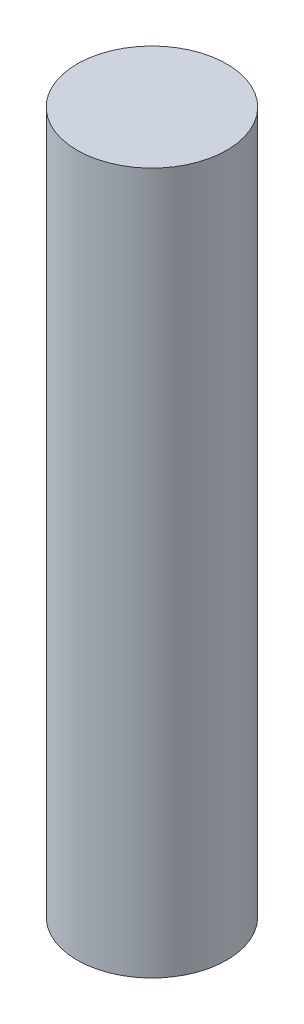
ISO-10303-21;
HEADER;
FILE_DESCRIPTION(('STEP AP214'),'2;1');
FILE_NAME('part.step','',(''),(''),'','','');
FILE_SCHEMA(('AUTOMOTIVE_DESIGN { 1 0 10303 214 1 1 1 1 }'));
ENDSEC;
DATA;
#1=APPLICATION_CONTEXT('core data for automotive mechanical design processes');
#2=APPLICATION_PROTOCOL_DEFINITION('international standard','automotive_design',2000,#1);
#3=PRODUCT_CONTEXT('',#1,'mechanical');
#4=PRODUCT('Part','Part','',(#3));
#5=PRODUCT_RELATED_PRODUCT_CATEGORY('part','',(#4));
#6=PRODUCT_DEFINITION_FORMATION('','',#4);
#7=PRODUCT_DEFINITION_CONTEXT('part definition',#1,'design');
#8=PRODUCT_DEFINITION('design','',#6,#7);
#9=PRODUCT_DEFINITION_SHAPE('','',#8);
#10=(LENGTH_UNIT() NAMED_UNIT(*) SI_UNIT(.MILLI.,.METRE.));
#11=(NAMED_UNIT(*) PLANE_ANGLE_UNIT() SI_UNIT($,.RADIAN.));
#12=(NAMED_UNIT(*) SI_UNIT($,.STERADIAN.) SOLID_ANGLE_UNIT());
#13=UNCERTAINTY_MEASURE_WITH_UNIT(LENGTH_MEASURE(1.E-05),#10,'distance_accuracy_value','');
#14=(GEOMETRIC_REPRESENTATION_CONTEXT(3) GLOBAL_UNCERTAINTY_ASSIGNED_CONTEXT((#13)) GLOBAL_UNIT_ASSIGNED_CONTEXT((#10,
#11,#12)) REPRESENTATION_CONTEXT('',''));
#15=CARTESIAN_POINT('',(0.,0.,0.));
#16=DIRECTION('',(0.,0.,1.));
#17=DIRECTION('',(1.,0.,0.));
#18=AXIS2_PLACEMENT_3D('',#15,#16,#17);
#19=CARTESIAN_POINT('',(0.,15.,0.));
#20=DIRECTION('',(0.,-1.,0.));
#21=DIRECTION('',(0.,0.,-1.));
#22=AXIS2_PLACEMENT_3D('',#19,#20,#21);
#23=CYLINDRICAL_SURFACE('',#22,1.6);
#24=CARTESIAN_POINT('',(0.,15.,0.));
#25=DIRECTION('',(0.,1.,0.));
#26=DIRECTION('',(0.,0.,1.));
#27=AXIS2_PLACEMENT_3D('',#24,#25,#26);
#28=CIRCLE('',#27,1.6);
#29=CARTESIAN_POINT('',(0.,15.,1.6));
#30=VERTEX_POINT('',#29);
#31=EDGE_CURVE('E10',#30,#30,#28,.T.);
#32=ORIENTED_EDGE('',*,*,#31,.F.);
#33=EDGE_LOOP('',(#32));
#34=FACE_BOUND('',#33,.T.);
#35=CARTESIAN_POINT('',(0.,0.,0.));
#36=DIRECTION('',(0.,1.,0.));
#37=DIRECTION('',(0.,0.,1.));
#38=AXIS2_PLACEMENT_3D('',#35,#36,#37);
#39=CIRCLE('',#38,1.6);
#40=CARTESIAN_POINT('',(0.,0.,1.6));
#41=VERTEX_POINT('',#40);
#42=EDGE_CURVE('E40',#41,#41,#39,.T.);
#43=ORIENTED_EDGE('',*,*,#42,.T.);
#44=EDGE_LOOP('',(#43));
#45=FACE_BOUND('',#44,.T.);
#46=ADVANCED_FACE('F37',(#34,#45),#23,.T.);
#47=CARTESIAN_POINT('',(0.,15.,0.));
#48=DIRECTION('',(0.,1.,0.));
#49=DIRECTION('',(0.,0.,1.));
#50=AXIS2_PLACEMENT_3D('',#47,#48,#49);
#51=PLANE('',#50);
#52=ORIENTED_EDGE('',*,*,#31,.T.);
#53=EDGE_LOOP('',(#52));
#54=FACE_BOUND('',#53,.T.);
#55=ADVANCED_FACE('F52',(#54),#51,.T.);
#56=CARTESIAN_POINT('',(0.,0.,0.));
#57=DIRECTION('',(0.,1.,0.));
#58=DIRECTION('',(0.,0.,1.));
#59=AXIS2_PLACEMENT_3D('',#56,#57,#58);
#60=PLANE('',#59);
#61=ORIENTED_EDGE('',*,*,#42,.F.);
#62=EDGE_LOOP('',(#61));
#63=FACE_BOUND('',#62,.T.);
#64=ADVANCED_FACE('F50',(#63),#60,.F.);
#65=CLOSED_SHELL('',(#46,#55,#64));
#66=MANIFOLD_SOLID_BREP('B2',#65);
#67=ADVANCED_BREP_SHAPE_REPRESENTATION('',(#18,#66),#14);
#68=SHAPE_DEFINITION_REPRESENTATION(#9,#67);
ENDSEC;
END-ISO-10303-21;
